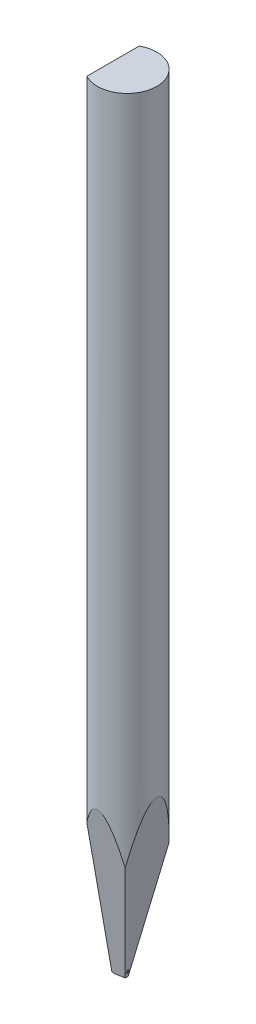
ISO-10303-21;
HEADER;
FILE_DESCRIPTION(('STEP AP214'),'2;1');
FILE_NAME('part.step','',(''),(''),'','','');
FILE_SCHEMA(('AUTOMOTIVE_DESIGN { 1 0 10303 214 1 1 1 1 }'));
ENDSEC;
DATA;
#1=APPLICATION_CONTEXT('core data for automotive mechanical design processes');
#2=APPLICATION_PROTOCOL_DEFINITION('international standard','automotive_design',2000,#1);
#3=PRODUCT_CONTEXT('',#1,'mechanical');
#4=PRODUCT('Part','Part','',(#3));
#5=PRODUCT_RELATED_PRODUCT_CATEGORY('part','',(#4));
#6=PRODUCT_DEFINITION_FORMATION('','',#4);
#7=PRODUCT_DEFINITION_CONTEXT('part definition',#1,'design');
#8=PRODUCT_DEFINITION('design','',#6,#7);
#9=PRODUCT_DEFINITION_SHAPE('','',#8);
#10=(LENGTH_UNIT() NAMED_UNIT(*) SI_UNIT(.MILLI.,.METRE.));
#11=(NAMED_UNIT(*) PLANE_ANGLE_UNIT() SI_UNIT($,.RADIAN.));
#12=(NAMED_UNIT(*) SI_UNIT($,.STERADIAN.) SOLID_ANGLE_UNIT());
#13=UNCERTAINTY_MEASURE_WITH_UNIT(LENGTH_MEASURE(1.E-05),#10,'distance_accuracy_value','');
#14=(GEOMETRIC_REPRESENTATION_CONTEXT(3) GLOBAL_UNCERTAINTY_ASSIGNED_CONTEXT((#13)) GLOBAL_UNIT_ASSIGNED_CONTEXT((#10,
#11,#12)) REPRESENTATION_CONTEXT('',''));
#15=CARTESIAN_POINT('',(0.,0.,0.));
#16=DIRECTION('',(0.,0.,1.));
#17=DIRECTION('',(1.,0.,0.));
#18=AXIS2_PLACEMENT_3D('',#15,#16,#17);
#19=CARTESIAN_POINT('',(-0.29972,0.,27.2760283406468));
#20=DIRECTION('',(-0.173648177666931,0.984807753012208,0.));
#21=DIRECTION('',(-0.984807753012208,-0.173648177666931,0.));
#22=AXIS2_PLACEMENT_3D('',#19,#20,#21);
#23=PLANE('',#22);
#24=DIRECTION('',(-0.984807753012208,-0.173648177666931,0.));
#25=VECTOR('',#24,1.);
#26=CARTESIAN_POINT('',(-0.29972,0.,0.0190499999999996));
#27=LINE('',#26,#25);
#28=CARTESIAN_POINT('',(-0.1397,0.0282158434529687,0.0190499999999998));
#29=VERTEX_POINT('',#28);
#30=CARTESIAN_POINT('',(-0.286429626386857,0.00234345145169317,0.01905));
#31=VERTEX_POINT('',#30);
#32=EDGE_CURVE('E172',#29,#31,#27,.T.);
#33=ORIENTED_EDGE('',*,*,#32,.F.);
#34=DIRECTION('',(0.,0.,1.));
#35=VECTOR('',#34,1.);
#36=CARTESIAN_POINT('',(-0.1397,0.0282158434529687,27.2760283406468));
#37=LINE('',#36,#35);
#38=CARTESIAN_POINT('',(-0.1397,0.0282158434529687,-0.0190499999999998));
#39=VERTEX_POINT('',#38);
#40=EDGE_CURVE('E11',#39,#29,#37,.T.);
#41=ORIENTED_EDGE('',*,*,#40,.F.);
#42=DIRECTION('',(-0.984807753012208,-0.173648177666931,0.));
#43=VECTOR('',#42,1.);
#44=CARTESIAN_POINT('',(-0.29972,0.,-0.0190499999999996));
#45=LINE('',#44,#43);
#46=CARTESIAN_POINT('',(-0.286429626386857,0.00234345145169317,-0.01905));
#47=VERTEX_POINT('',#46);
#48=EDGE_CURVE('E136',#39,#47,#45,.T.);
#49=ORIENTED_EDGE('',*,*,#48,.T.);
#50=CARTESIAN_POINT('',(-0.983960151536872,-0.12065,0.));
#51=DIRECTION('',(-0.173648177666931,0.984807753012208,0.));
#52=DIRECTION('',(-0.984807753012208,-0.173648177666931,0.));
#53=AXIS2_PLACEMENT_3D('',#50,#51,#52);
#54=ELLIPSE('',#53,0.716736574332053,0.12446);
#55=CARTESIAN_POINT('',(-0.299719999999998,0.,-0.0305196359577053));
#56=VERTEX_POINT('',#55);
#57=EDGE_CURVE('E214',#47,#56,#54,.T.);
#58=ORIENTED_EDGE('',*,*,#57,.T.);
#59=DIRECTION('',(0.984346441568213,0.173566836012845,-0.0306045161452665));
#60=VECTOR('',#59,1.);
#61=CARTESIAN_POINT('',(26.0298035813508,4.64260539659194,-0.849096592201888));
#62=LINE('',#61,#60);
#63=CARTESIAN_POINT('',(-0.0113543651851166,0.0508466417269886,-0.0394456348148849));
#64=VERTEX_POINT('',#63);
#65=EDGE_CURVE('E261',#56,#64,#62,.T.);
#66=ORIENTED_EDGE('',*,*,#65,.T.);
#67=DIRECTION('',(0.,0.,-1.));
#68=VECTOR('',#67,1.);
#69=CARTESIAN_POINT('',(-0.0113543651851151,0.0508466417269888,27.2760283406468));
#70=LINE('',#69,#68);
#71=CARTESIAN_POINT('',(-0.0113543651851166,0.0508466417269886,0.0394456348148849));
#72=VERTEX_POINT('',#71);
#73=EDGE_CURVE('E227',#72,#64,#70,.T.);
#74=ORIENTED_EDGE('',*,*,#73,.F.);
#75=DIRECTION('',(-0.984346441568213,-0.173566836012845,-0.0306045161452665));
#76=VECTOR('',#75,1.);
#77=CARTESIAN_POINT('',(26.0298035813508,4.64260539659194,0.849096592201888));
#78=LINE('',#77,#76);
#79=CARTESIAN_POINT('',(-0.299719999999996,0.,0.0305196359577053));
#80=VERTEX_POINT('',#79);
#81=EDGE_CURVE('E236',#72,#80,#78,.T.);
#82=ORIENTED_EDGE('',*,*,#81,.T.);
#83=EDGE_CURVE('E217',#80,#31,#54,.T.);
#84=ORIENTED_EDGE('',*,*,#83,.T.);
#85=EDGE_LOOP('',(#33,#41,#49,#58,#66,#74,#82,#84));
#86=FACE_BOUND('',#85,.T.);
#87=ADVANCED_FACE('F43',(#86),#23,.F.);
#88=CARTESIAN_POINT('',(26.8389469491216,-0.12065,0.));
#89=DIRECTION('',(-1.,0.,0.));
#90=DIRECTION('',(0.,0.,1.));
#91=AXIS2_PLACEMENT_3D('',#88,#89,#90);
#92=CYLINDRICAL_SURFACE('',#91,0.12446);
#93=DIRECTION('',(-1.,0.,0.));
#94=VECTOR('',#93,1.);
#95=CARTESIAN_POINT('',(26.8389469491216,0.00234345145169317,0.01905));
#96=LINE('',#95,#94);
#97=CARTESIAN_POINT('',(-0.301769962417407,0.00234345145169282,0.01905));
#98=VERTEX_POINT('',#97);
#99=EDGE_CURVE('E51',#31,#98,#96,.T.);
#100=ORIENTED_EDGE('',*,*,#99,.F.);
#101=ORIENTED_EDGE('',*,*,#83,.F.);
#102=CARTESIAN_POINT('',(-0.29972,0.,0.0305592719154106));
#103=DIRECTION('',(-1.,0.,0.));
#104=VECTOR('',#103,1.);
#105=LINE('',#102,#104);
#106=CARTESIAN_POINT('',(-0.347979999999999,0.,0.0305196359577053));
#107=VERTEX_POINT('',#106);
#108=EDGE_CURVE('E66',#80,#107,#105,.T.);
#109=ORIENTED_EDGE('',*,*,#108,.T.);
#110=CARTESIAN_POINT('',(-0.34798,0.,-0.0305592719154105));
#111=CARTESIAN_POINT('',(-0.348430814510365,-4.0790157401786E-07,-0.030560581386463));
#112=CARTESIAN_POINT('',(-0.348879913015498,1.08939864350477E-05,-0.0305162789202461));
#113=CARTESIAN_POINT('',(-0.349756979795945,5.32586660468888E-05,-0.0303484247483048));
#114=CARTESIAN_POINT('',(-0.350185131865885,8.40923596505527E-05,-0.0302257916828257));
#115=CARTESIAN_POINT('',(-0.351011762424045,0.000161841460247365,-0.0299134495677672));
#116=CARTESIAN_POINT('',(-0.351410362022562,0.000208686245204474,-0.0297240349657186));
#117=CARTESIAN_POINT('',(-0.352176540220128,0.000314247686217708,-0.0292915141713706));
#118=CARTESIAN_POINT('',(-0.352544019029949,0.000373000623512143,-0.0290482436791118));
#119=CARTESIAN_POINT('',(-0.353492609976714,0.000542464303570054,-0.0283352771344417));
#120=CARTESIAN_POINT('',(-0.354042823136011,0.000660718500816304,-0.0278264292093499));
#121=CARTESIAN_POINT('',(-0.355058485849617,0.000906480045085761,-0.0267326241717132));
#122=CARTESIAN_POINT('',(-0.355523692710971,0.00103401247561593,-0.0261474570746311));
#123=CARTESIAN_POINT('',(-0.356737267127974,0.00139509322037842,-0.024424665265501));
#124=CARTESIAN_POINT('',(-0.357402825120589,0.00162934905892421,-0.0232293596959535));
#125=CARTESIAN_POINT('',(-0.358560754617679,0.00207372872141576,-0.0207553925747807));
#126=CARTESIAN_POINT('',(-0.359052698197646,0.00228379206987497,-0.0194765341415885));
#127=CARTESIAN_POINT('',(-0.36030774701552,0.00284958434009851,-0.0156411550181883));
#128=CARTESIAN_POINT('',(-0.360888602450784,0.00315568845104849,-0.0130178775361172));
#129=CARTESIAN_POINT('',(-0.361706163735848,0.00360035199279706,-0.00770331230592785));
#130=CARTESIAN_POINT('',(-0.361941722221542,0.00373835258818556,-0.00501182791337141));
#131=CARTESIAN_POINT('',(-0.362122159422928,0.00384312710698266,0.000626307070904409));
#132=CARTESIAN_POINT('',(-0.362039043463169,0.00379341669557573,0.00357417277699146));
#133=CARTESIAN_POINT('',(-0.36150170314798,0.00348744188955353,0.00941520395438301));
#134=CARTESIAN_POINT('',(-0.361049465589899,0.0032322834184667,0.0123085776336631));
#135=CARTESIAN_POINT('',(-0.360101881253082,0.00276522394071858,0.0161243719322801));
#136=CARTESIAN_POINT('',(-0.359823561043634,0.00263206670724784,0.0171113029227183));
#137=CARTESIAN_POINT('',(-0.359191091592352,0.00234550293161942,0.0190622381461741));
#138=CARTESIAN_POINT('',(-0.358836664817193,0.00219202308727775,0.0200261437209395));
#139=CARTESIAN_POINT('',(-0.35792019094462,0.00182196264863964,0.0221910750494741));
#140=CARTESIAN_POINT('',(-0.35732773854375,0.00160009037378041,0.0233785738678838));
#141=CARTESIAN_POINT('',(-0.355941185679961,0.00114822728257018,0.0256274014231926));
#142=CARTESIAN_POINT('',(-0.35514861217987,0.000918308819136108,0.0266895999907303));
#143=CARTESIAN_POINT('',(-0.353869594547934,0.000625501592054897,0.027976474269296));
#144=CARTESIAN_POINT('',(-0.353498623594593,0.000547541257563668,0.0283116735867265));
#145=CARTESIAN_POINT('',(-0.352713845163361,0.000401035258663639,0.0289316105181223));
#146=CARTESIAN_POINT('',(-0.352300015965373,0.000332494409296592,0.0292163223453788));
#147=CARTESIAN_POINT('',(-0.35142414885153,0.000209524327572587,0.0297209697927657));
#148=CARTESIAN_POINT('',(-0.350961529273433,0.000155300800887052,0.0299399667559707));
#149=CARTESIAN_POINT('',(-0.350001496573154,6.91140443385488E-05,0.030285638001186));
#150=CARTESIAN_POINT('',(-0.349504228801302,3.70633361955864E-05,0.0304126751846489));
#151=CARTESIAN_POINT('',(-0.348830789757912,1.24370193427594E-05,0.0305101337557273));
#152=CARTESIAN_POINT('',(-0.348661251457123,7.78649892713723E-06,0.0305285162109277));
#153=CARTESIAN_POINT('',(-0.348321176485651,1.56788977353475E-06,0.0305530840375707));
#154=CARTESIAN_POINT('',(-0.348150639475355,9.18970805127776E-10,0.0305592649853819));
#155=CARTESIAN_POINT('',(-0.347980000000024,0.,0.0305592719155779));
#156=B_SPLINE_CURVE_WITH_KNOTS('',3,(#110,#111,#112,#113,#114,#115,#116,#117,#118,#119,#120,
#121,#122,#123,#124,#125,#126,#127,#128,#129,#130,#131,#132,#133,#134,#135,#136,#137,#138,#139,
#140,#141,#142,#143,#144,#145,#146,#147,#148,#149,#150,#151,#152,#153,#154,#155),.UNSPECIFIED.,
.F.,.F.,(4,2,2,2,2,2,2,2,2,2,2,2,2,2,2,2,2,2,2,2,2,2,4),(0.,0.00134741004079565,
0.00267930111383719,0.00400539168870872,0.00533558497102969,0.00759858100656418,
0.00986794025135302,0.0140085166125864,0.0181592285296514,0.0262271883927134,0.0343218964425103,
0.0431433167180924,0.0519175663828487,0.0550173321670425,0.0581285996977776,0.0621538633051677,
0.0661492954960546,0.0676639727026794,0.0691794213229861,0.0707155853403851,0.0722456536356855,
0.0727570681004673,0.0732686679434896),.UNSPECIFIED.);
#157=CARTESIAN_POINT('',(-0.347980000000002,0.,-0.030519635957705));
#158=VERTEX_POINT('',#157);
#159=EDGE_CURVE('E212',#158,#107,#156,.T.);
#160=ORIENTED_EDGE('',*,*,#159,.F.);
#161=CARTESIAN_POINT('',(-0.299719999999993,0.,-0.0304800000000001));
#162=DIRECTION('',(-1.,0.,0.));
#163=VECTOR('',#162,1.);
#164=LINE('',#161,#163);
#165=EDGE_CURVE('E241',#56,#158,#164,.T.);
#166=ORIENTED_EDGE('',*,*,#165,.F.);
#167=ORIENTED_EDGE('',*,*,#57,.F.);
#168=DIRECTION('',(-1.,0.,0.));
#169=VECTOR('',#168,1.);
#170=CARTESIAN_POINT('',(26.8389469491216,0.00234345145169317,-0.01905));
#171=LINE('',#170,#169);
#172=CARTESIAN_POINT('',(-0.301769962417407,0.00234345145169364,-0.01905));
#173=VERTEX_POINT('',#172);
#174=EDGE_CURVE('E218',#47,#173,#171,.T.);
#175=ORIENTED_EDGE('',*,*,#174,.T.);
#176=CARTESIAN_POINT('',(-0.301769962417407,0.00234345145169314,-0.01905));
#177=CARTESIAN_POINT('',(-0.303083212357795,0.00234273884135903,-0.0190505532683335));
#178=CARTESIAN_POINT('',(-0.304398530056794,0.00235919648592935,-0.0189481276282325));
#179=CARTESIAN_POINT('',(-0.307000954094572,0.00242318594032791,-0.0185302442706134));
#180=CARTESIAN_POINT('',(-0.308287873692993,0.00247088218091991,-0.0182136589885027));
#181=CARTESIAN_POINT('',(-0.310790852582439,0.00259423811870583,-0.0173587153989119));
#182=CARTESIAN_POINT('',(-0.312006641691863,0.00266999731654825,-0.0168195671794881));
#183=CARTESIAN_POINT('',(-0.314311894657055,0.00283986679158173,-0.015523243690556));
#184=CARTESIAN_POINT('',(-0.315401659849181,0.00293393178806268,-0.0147666042420507));
#185=CARTESIAN_POINT('',(-0.31730332104955,0.00311685645192294,-0.0131397171256992));
#186=CARTESIAN_POINT('',(-0.318132319467869,0.00320524260215012,-0.0122894206437063));
#187=CARTESIAN_POINT('',(-0.3196165652278,0.00337418177810725,-0.0104472759959153));
#188=CARTESIAN_POINT('',(-0.320271844381019,0.00345473623626944,-0.00945545379765719));
#189=CARTESIAN_POINT('',(-0.3213234426909,0.00358935319513246,-0.00746762605607109));
#190=CARTESIAN_POINT('',(-0.32173909228563,0.00364525831027112,-0.00648193686690554));
#191=CARTESIAN_POINT('',(-0.322389726393463,0.00373449435681656,-0.0044518189481206));
#192=CARTESIAN_POINT('',(-0.322624798676981,0.00376783625423748,-0.00340741902037943));
#193=CARTESIAN_POINT('',(-0.322897837996913,0.00380671319708877,-0.00134948273672548));
#194=CARTESIAN_POINT('',(-0.322945634936013,0.00381363450040313,-0.000337264641997512));
#195=CARTESIAN_POINT('',(-0.322869697716228,0.00380274111245844,0.00168052629893266));
#196=CARTESIAN_POINT('',(-0.322745983850237,0.00378492934757725,0.00268609991715538));
#197=CARTESIAN_POINT('',(-0.322334355344498,0.00372702254235129,0.0046473278957709));
#198=CARTESIAN_POINT('',(-0.322048793640665,0.00368724701865936,0.00560348787902325));
#199=CARTESIAN_POINT('',(-0.321324937242233,0.00358998817113897,0.00745501684823445));
#200=CARTESIAN_POINT('',(-0.320886639683836,0.00353250451528526,0.00835038469396416));
#201=CARTESIAN_POINT('',(-0.319862680839835,0.00340476764403495,0.0100730618825254));
#202=CARTESIAN_POINT('',(-0.319274533821476,0.00333430521919907,0.0108988749361181));
#203=CARTESIAN_POINT('',(-0.317974173980919,0.00318863460274331,0.0124454369952645));
#204=CARTESIAN_POINT('',(-0.317261944798882,0.00311342578616174,0.0131661721235828));
#205=CARTESIAN_POINT('',(-0.31569583062112,0.00296171888527247,0.0145232749481605));
#206=CARTESIAN_POINT('',(-0.314836555870207,0.00288535232362802,0.0151534243532859));
#207=CARTESIAN_POINT('',(-0.313030647680624,0.00274271134593144,0.0162742350252514));
#208=CARTESIAN_POINT('',(-0.312083969657596,0.00267644212671652,0.0167648245761543));
#209=CARTESIAN_POINT('',(-0.31004264333725,0.00255444746912226,0.0176399463518506));
#210=CARTESIAN_POINT('',(-0.308942302803632,0.00250016076595805,0.0180113663892418));
#211=CARTESIAN_POINT('',(-0.306698785837096,0.00241476087320615,0.0185861575843008));
#212=CARTESIAN_POINT('',(-0.305555627526932,0.00238363799331208,0.0187895990176943));
#213=CARTESIAN_POINT('',(-0.30352895790095,0.00235048998193052,0.0190043678177182));
#214=CARTESIAN_POINT('',(-0.302649080375743,0.00234326902739348,0.0190501179681685));
#215=CARTESIAN_POINT('',(-0.301769962417412,0.00234345145168755,0.0190500000000401));
#216=B_SPLINE_CURVE_WITH_KNOTS('',3,(#176,#177,#178,#179,#180,#181,#182,#183,#184,#185,#186,
#187,#188,#189,#190,#191,#192,#193,#194,#195,#196,#197,#198,#199,#200,#201,#202,#203,#204,#205,
#206,#207,#208,#209,#210,#211,#212,#213,#214,#215),.UNSPECIFIED.,.F.,.F.,(4,2,2,2,2,2,2,2,2,2,2,
2,2,2,2,2,2,2,2,4),(0.,0.0039388640861778,0.00789862964445358,0.0118725715602336,
0.0158368057995756,0.0193894604666261,0.0229414641187126,0.0261386218593387,0.0293342246220546,
0.0323596502009959,0.0353847178468262,0.0383668955619843,0.0413491291960031,0.0443844811882459,
0.0474202336852696,0.0506115954385173,0.0538045941937902,0.0572782451267952,0.0607504420817328,
0.063388074501748),.UNSPECIFIED.);
#217=EDGE_CURVE('E308',#173,#98,#216,.T.);
#218=ORIENTED_EDGE('',*,*,#217,.T.);
#219=EDGE_LOOP('',(#100,#101,#109,#160,#166,#167,#175,#218));
#220=FACE_BOUND('',#219,.T.);
#221=ADVANCED_FACE('F182',(#220),#92,.F.);
#222=CARTESIAN_POINT('',(26.8738719491216,0.,0.03048));
#223=DIRECTION('',(0.,-0.173648177666931,0.984807753012208));
#224=DIRECTION('',(0.,-0.984807753012208,-0.173648177666931));
#225=AXIS2_PLACEMENT_3D('',#222,#223,#224);
#226=PLANE('',#225);
#227=CARTESIAN_POINT('',(-0.34798,0.02794,0.0354065758409947));
#228=DIRECTION('',(0.,-0.173648177666931,0.984807753012208));
#229=DIRECTION('',(0.,-0.984807753012208,-0.173648177666931));
#230=AXIS2_PLACEMENT_3D('',#227,#228,#229);
#231=ELLIPSE('',#230,0.0283710195360877,0.02794);
#232=CARTESIAN_POINT('',(-0.37592,0.02794,0.0354065758409947));
#233=VERTEX_POINT('',#232);
#234=EDGE_CURVE('E226',#107,#233,#231,.F.);
#235=ORIENTED_EDGE('',*,*,#234,.F.);
#236=ORIENTED_EDGE('',*,*,#108,.F.);
#237=ORIENTED_EDGE('',*,*,#81,.F.);
#238=DIRECTION('',(-0.171087869746036,-0.970287525247814,-0.171087869746036));
#239=VECTOR('',#238,1.);
#240=CARTESIAN_POINT('',(0.766901483986011,4.46455489014234,0.817701483986016));
#241=LINE('',#240,#239);
#242=CARTESIAN_POINT('',(0.534392028524877,3.1459282424964,0.58519202852488));
#243=VERTEX_POINT('',#242);
#244=EDGE_CURVE('E233',#243,#72,#241,.T.);
#245=ORIENTED_EDGE('',*,*,#244,.F.);
#246=CARTESIAN_POINT('',(0.,-0.172860669861948,0.));
#247=DIRECTION('',(0.,-0.173648177666931,0.984807753012208));
#248=DIRECTION('',(0.,-0.984807753012208,-0.173648177666931));
#249=AXIS2_PLACEMENT_3D('',#246,#247,#248);
#250=ELLIPSE('',#249,4.56371043248163,0.792479999999998);
#251=CARTESIAN_POINT('',(-0.37592,3.78368137728878,0.69764511322018));
#252=VERTEX_POINT('',#251);
#253=EDGE_CURVE('E237',#243,#252,#250,.T.);
#254=ORIENTED_EDGE('',*,*,#253,.T.);
#255=DIRECTION('',(0.,0.984807753012208,0.173648177666931));
#256=VECTOR('',#255,1.);
#257=CARTESIAN_POINT('',(-0.37592,20.2128607163583,3.59455270159622));
#258=LINE('',#257,#256);
#259=EDGE_CURVE('E253',#233,#252,#258,.T.);
#260=ORIENTED_EDGE('',*,*,#259,.F.);
#261=EDGE_LOOP('',(#235,#236,#237,#245,#254,#260));
#262=FACE_BOUND('',#261,.T.);
#263=ADVANCED_FACE('F192',(#262),#226,.T.);
#264=CARTESIAN_POINT('',(26.8738719491216,0.,-0.03048));
#265=DIRECTION('',(0.,-0.173648177666931,-0.984807753012208));
#266=DIRECTION('',(0.,0.984807753012208,-0.173648177666931));
#267=AXIS2_PLACEMENT_3D('',#264,#265,#266);
#268=PLANE('',#267);
#269=CARTESIAN_POINT('',(-0.34798,0.02794,-0.0354065758409947));
#270=DIRECTION('',(0.,-0.173648177666931,-0.984807753012208));
#271=DIRECTION('',(0.,0.984807753012208,-0.173648177666931));
#272=AXIS2_PLACEMENT_3D('',#269,#270,#271);
#273=ELLIPSE('',#272,0.0283710195360877,0.02794);
#274=CARTESIAN_POINT('',(-0.37592,0.02794,-0.0354065758409947));
#275=VERTEX_POINT('',#274);
#276=EDGE_CURVE('E300',#275,#158,#273,.F.);
#277=ORIENTED_EDGE('',*,*,#276,.F.);
#278=DIRECTION('',(0.,-0.984807753012208,0.173648177666931));
#279=VECTOR('',#278,1.);
#280=CARTESIAN_POINT('',(-0.37592,20.5707779559457,-3.65766316779618));
#281=LINE('',#280,#279);
#282=CARTESIAN_POINT('',(-0.37592,3.78368137728877,-0.69764511322018));
#283=VERTEX_POINT('',#282);
#284=EDGE_CURVE('E255',#283,#275,#281,.T.);
#285=ORIENTED_EDGE('',*,*,#284,.F.);
#286=CARTESIAN_POINT('',(0.,-0.172860669861948,0.));
#287=DIRECTION('',(0.,-0.173648177666931,-0.984807753012208));
#288=DIRECTION('',(0.,-0.984807753012208,0.173648177666931));
#289=AXIS2_PLACEMENT_3D('',#286,#287,#288);
#290=ELLIPSE('',#289,4.56371043248163,0.792479999999998);
#291=CARTESIAN_POINT('',(0.534392028524877,3.1459282424964,-0.58519202852488));
#292=VERTEX_POINT('',#291);
#293=EDGE_CURVE('E240',#283,#292,#290,.T.);
#294=ORIENTED_EDGE('',*,*,#293,.T.);
#295=DIRECTION('',(0.171087869746036,0.970287525247814,-0.171087869746036));
#296=VECTOR('',#295,1.);
#297=CARTESIAN_POINT('',(0.766901483986011,4.46455489014234,-0.817701483986016));
#298=LINE('',#297,#296);
#299=EDGE_CURVE('E258',#64,#292,#298,.T.);
#300=ORIENTED_EDGE('',*,*,#299,.F.);
#301=ORIENTED_EDGE('',*,*,#65,.F.);
#302=ORIENTED_EDGE('',*,*,#165,.T.);
#303=EDGE_LOOP('',(#277,#285,#294,#300,#301,#302));
#304=FACE_BOUND('',#303,.T.);
#305=ADVANCED_FACE('F280',(#304),#268,.T.);
#306=CARTESIAN_POINT('',(0.,21.0312,0.));
#307=DIRECTION('',(0.,-1.,0.));
#308=DIRECTION('',(0.,0.,-1.));
#309=AXIS2_PLACEMENT_3D('',#306,#307,#308);
#310=CYLINDRICAL_SURFACE('',#309,0.792479999999998);
#311=ORIENTED_EDGE('',*,*,#253,.F.);
#312=CARTESIAN_POINT('',(0.,0.115240446574631,0.));
#313=DIRECTION('',(-0.984807753012208,0.173648177666931,0.));
#314=DIRECTION('',(-0.173648177666931,-0.984807753012208,0.));
#315=AXIS2_PLACEMENT_3D('',#312,#313,#314);
#316=ELLIPSE('',#315,4.56371043248165,0.792479999999998);
#317=EDGE_CURVE('E230',#243,#292,#316,.T.);
#318=ORIENTED_EDGE('',*,*,#317,.T.);
#319=ORIENTED_EDGE('',*,*,#293,.F.);
#320=DIRECTION('',(0.,-1.,0.));
#321=VECTOR('',#320,1.);
#322=CARTESIAN_POINT('',(-0.37592,21.0312,-0.69764511322018));
#323=LINE('',#322,#321);
#324=CARTESIAN_POINT('',(-0.37592,21.0312,-0.69764511322018));
#325=VERTEX_POINT('',#324);
#326=EDGE_CURVE('E247',#325,#283,#323,.T.);
#327=ORIENTED_EDGE('',*,*,#326,.F.);
#328=CARTESIAN_POINT('',(0.,21.0312,0.));
#329=DIRECTION('',(0.,1.,0.));
#330=DIRECTION('',(0.,0.,1.));
#331=AXIS2_PLACEMENT_3D('',#328,#329,#330);
#332=CIRCLE('',#331,0.792479999999998);
#333=CARTESIAN_POINT('',(-0.37592,21.0312,0.69764511322018));
#334=VERTEX_POINT('',#333);
#335=EDGE_CURVE('E250',#334,#325,#332,.T.);
#336=ORIENTED_EDGE('',*,*,#335,.F.);
#337=DIRECTION('',(0.,-1.,0.));
#338=VECTOR('',#337,1.);
#339=CARTESIAN_POINT('',(-0.37592,21.0312,0.69764511322018));
#340=LINE('',#339,#338);
#341=EDGE_CURVE('E245',#252,#334,#340,.F.);
#342=ORIENTED_EDGE('',*,*,#341,.F.);
#343=EDGE_LOOP('',(#311,#318,#319,#327,#336,#342));
#344=FACE_BOUND('',#343,.T.);
#345=ADVANCED_FACE('F45',(#344),#310,.T.);
#346=CARTESIAN_POINT('',(-0.37592,21.0312,-1.04648));
#347=DIRECTION('',(-1.,0.,0.));
#348=DIRECTION('',(0.,0.,1.));
#349=AXIS2_PLACEMENT_3D('',#346,#347,#348);
#350=PLANE('',#349);
#351=DIRECTION('',(0.,0.,-1.));
#352=VECTOR('',#351,1.);
#353=CARTESIAN_POINT('',(-0.37592,0.02794,26.4420719491216));
#354=LINE('',#353,#352);
#355=EDGE_CURVE('E222',#233,#275,#354,.T.);
#356=ORIENTED_EDGE('',*,*,#355,.F.);
#357=ORIENTED_EDGE('',*,*,#259,.T.);
#358=ORIENTED_EDGE('',*,*,#341,.T.);
#359=DIRECTION('',(0.,0.,-1.));
#360=VECTOR('',#359,1.);
#361=CARTESIAN_POINT('',(-0.37592,21.0312,-1.04648));
#362=LINE('',#361,#360);
#363=EDGE_CURVE('E243',#334,#325,#362,.T.);
#364=ORIENTED_EDGE('',*,*,#363,.T.);
#365=ORIENTED_EDGE('',*,*,#326,.T.);
#366=ORIENTED_EDGE('',*,*,#284,.T.);
#367=EDGE_LOOP('',(#356,#357,#358,#364,#365,#366));
#368=FACE_BOUND('',#367,.T.);
#369=ADVANCED_FACE('F285',(#368),#350,.T.);
#370=CARTESIAN_POINT('',(0.,21.0312,0.));
#371=DIRECTION('',(0.,1.,0.));
#372=DIRECTION('',(0.,0.,1.));
#373=AXIS2_PLACEMENT_3D('',#370,#371,#372);
#374=PLANE('',#373);
#375=ORIENTED_EDGE('',*,*,#335,.T.);
#376=ORIENTED_EDGE('',*,*,#363,.F.);
#377=EDGE_LOOP('',(#375,#376));
#378=FACE_BOUND('',#377,.T.);
#379=ADVANCED_FACE('F325',(#378),#374,.T.);
#380=CARTESIAN_POINT('',(-0.0113543651851151,0.0508466417269888,27.2760283406468));
#381=DIRECTION('',(-0.984807753012208,0.173648177666931,0.));
#382=DIRECTION('',(-0.173648177666931,-0.984807753012208,0.));
#383=AXIS2_PLACEMENT_3D('',#380,#381,#382);
#384=PLANE('',#383);
#385=CARTESIAN_POINT('',(0.0138139834213155,0.193583439608439,0.));
#386=DIRECTION('',(-0.984807753012208,0.173648177666931,0.));
#387=DIRECTION('',(0.173648177666931,0.984807753012208,0.));
#388=AXIS2_PLACEMENT_3D('',#385,#386,#387);
#389=ELLIPSE('',#388,0.0439502823592256,0.0315688581959235);
#390=CARTESIAN_POINT('',(0.0214458698609421,0.23686601842288,0.));
#391=VERTEX_POINT('',#390);
#392=EDGE_CURVE('E174',#391,#391,#389,.F.);
#393=ORIENTED_EDGE('',*,*,#392,.F.);
#394=EDGE_LOOP('',(#393));
#395=FACE_BOUND('',#394,.T.);
#396=ORIENTED_EDGE('',*,*,#317,.F.);
#397=ORIENTED_EDGE('',*,*,#244,.T.);
#398=ORIENTED_EDGE('',*,*,#73,.T.);
#399=ORIENTED_EDGE('',*,*,#299,.T.);
#400=EDGE_LOOP('',(#396,#397,#398,#399));
#401=FACE_BOUND('',#400,.T.);
#402=ADVANCED_FACE('F322',(#395,#401),#384,.F.);
#403=CARTESIAN_POINT('',(-0.34798,0.02794,26.4420719491216));
#404=DIRECTION('',(0.,0.,-1.));
#405=DIRECTION('',(-1.,0.,0.));
#406=AXIS2_PLACEMENT_3D('',#403,#404,#405);
#407=CYLINDRICAL_SURFACE('',#406,0.02794);
#408=ORIENTED_EDGE('',*,*,#276,.T.);
#409=ORIENTED_EDGE('',*,*,#159,.T.);
#410=ORIENTED_EDGE('',*,*,#234,.T.);
#411=ORIENTED_EDGE('',*,*,#355,.T.);
#412=EDGE_LOOP('',(#408,#409,#410,#411));
#413=FACE_BOUND('',#412,.T.);
#414=ADVANCED_FACE('F197',(#413),#407,.T.);
#415=CARTESIAN_POINT('',(-0.1397,0.09144,0.01905));
#416=DIRECTION('',(-1.,0.,0.));
#417=DIRECTION('',(0.,-1.,0.));
#418=AXIS2_PLACEMENT_3D('',#415,#416,#417);
#419=PLANE('',#418);
#420=ORIENTED_EDGE('',*,*,#40,.T.);
#421=DIRECTION('',(0.,1.,0.));
#422=VECTOR('',#421,1.);
#423=CARTESIAN_POINT('',(-0.1397,0.09144,0.01905));
#424=LINE('',#423,#422);
#425=CARTESIAN_POINT('',(-0.1397,0.09144,0.01905));
#426=VERTEX_POINT('',#425);
#427=EDGE_CURVE('E146',#29,#426,#424,.T.);
#428=ORIENTED_EDGE('',*,*,#427,.T.);
#429=CARTESIAN_POINT('',(-0.1397,0.0914400000000001,0.));
#430=DIRECTION('',(-1.,0.,0.));
#431=DIRECTION('',(0.,1.,0.));
#432=AXIS2_PLACEMENT_3D('',#429,#430,#431);
#433=ELLIPSE('',#432,0.0219970452561247,0.01905);
#434=CARTESIAN_POINT('',(-0.1397,0.09144,-0.01905));
#435=VERTEX_POINT('',#434);
#436=EDGE_CURVE('E142',#426,#435,#433,.F.);
#437=ORIENTED_EDGE('',*,*,#436,.T.);
#438=DIRECTION('',(0.,1.,0.));
#439=VECTOR('',#438,1.);
#440=CARTESIAN_POINT('',(-0.1397,0.09144,-0.01905));
#441=LINE('',#440,#439);
#442=EDGE_CURVE('E130',#39,#435,#441,.T.);
#443=ORIENTED_EDGE('',*,*,#442,.F.);
#444=EDGE_LOOP('',(#420,#428,#437,#443));
#445=FACE_BOUND('',#444,.T.);
#446=ADVANCED_FACE('F144',(#445),#419,.T.);
#447=CARTESIAN_POINT('',(-0.0108977128619794,0.165804035151375,0.));
#448=DIRECTION('',(0.866025403784441,0.499999999999995,0.));
#449=DIRECTION('',(-0.499999999999995,0.866025403784441,0.));
#450=AXIS2_PLACEMENT_3D('',#447,#448,#449);
#451=CONICAL_SURFACE('',#450,0.01905,0.392699081698725);
#452=CARTESIAN_POINT('',(-0.0108977128619794,0.165804035151375,0.));
#453=DIRECTION('',(0.866025403784441,0.499999999999995,0.));
#454=DIRECTION('',(-0.499999999999995,0.866025403784441,0.));
#455=AXIS2_PLACEMENT_3D('',#452,#453,#454);
#456=CIRCLE('',#455,0.01905);
#457=CARTESIAN_POINT('',(-0.0204227128619793,0.182301819093468,0.));
#458=VERTEX_POINT('',#457);
#459=EDGE_CURVE('E150',#458,#458,#456,.T.);
#460=ORIENTED_EDGE('',*,*,#459,.F.);
#461=EDGE_LOOP('',(#460));
#462=FACE_BOUND('',#461,.T.);
#463=ORIENTED_EDGE('',*,*,#392,.T.);
#464=EDGE_LOOP('',(#463));
#465=FACE_BOUND('',#464,.T.);
#466=ADVANCED_FACE('F320',(#462,#465),#451,.F.);
#467=CARTESIAN_POINT('',(-0.250330046129175,0.09144,0.));
#468=DIRECTION('',(-0.500000000000004,-0.866025403784436,0.));
#469=DIRECTION('',(0.866025403784436,-0.500000000000004,0.));
#470=AXIS2_PLACEMENT_3D('',#467,#468,#469);
#471=CYLINDRICAL_SURFACE('',#470,0.01905);
#472=DIRECTION('',(0.500000000000004,0.866025403784436,0.));
#473=VECTOR('',#472,1.);
#474=CARTESIAN_POINT('',(-0.250330046129175,0.09144,-0.01905));
#475=LINE('',#474,#473);
#476=CARTESIAN_POINT('',(-0.250330046129175,0.09144,-0.01905));
#477=VERTEX_POINT('',#476);
#478=EDGE_CURVE('E58',#173,#477,#475,.T.);
#479=ORIENTED_EDGE('',*,*,#478,.T.);
#480=CARTESIAN_POINT('',(-0.250330046129175,0.09144,0.));
#481=DIRECTION('',(0.,-1.,0.));
#482=DIRECTION('',(-1.,0.,0.));
#483=AXIS2_PLACEMENT_3D('',#480,#481,#482);
#484=ELLIPSE('',#483,0.0219970452561248,0.01905);
#485=CARTESIAN_POINT('',(-0.250330046129175,0.09144,0.01905));
#486=VERTEX_POINT('',#485);
#487=EDGE_CURVE('E159',#477,#486,#484,.F.);
#488=ORIENTED_EDGE('',*,*,#487,.T.);
#489=DIRECTION('',(-0.500000000000004,-0.866025403784436,0.));
#490=VECTOR('',#489,1.);
#491=CARTESIAN_POINT('',(-0.227342216057905,0.131256089639199,0.01905));
#492=LINE('',#491,#490);
#493=EDGE_CURVE('E166',#486,#98,#492,.T.);
#494=ORIENTED_EDGE('',*,*,#493,.T.);
#495=ORIENTED_EDGE('',*,*,#217,.F.);
#496=EDGE_LOOP('',(#479,#488,#494,#495));
#497=FACE_BOUND('',#496,.T.);
#498=ADVANCED_FACE('F194',(#497),#471,.F.);
#499=CARTESIAN_POINT('',(0.,0.,0.01905));
#500=DIRECTION('',(0.,0.,-1.));
#501=DIRECTION('',(-1.,0.,0.));
#502=AXIS2_PLACEMENT_3D('',#499,#500,#501);
#503=PLANE('',#502);
#504=ORIENTED_EDGE('',*,*,#32,.T.);
#505=ORIENTED_EDGE('',*,*,#99,.T.);
#506=ORIENTED_EDGE('',*,*,#493,.F.);
#507=DIRECTION('',(-1.,0.,0.));
#508=VECTOR('',#507,1.);
#509=CARTESIAN_POINT('',(-0.2723270913853,0.09144,0.01905));
#510=LINE('',#509,#508);
#511=EDGE_CURVE('E139',#426,#486,#510,.T.);
#512=ORIENTED_EDGE('',*,*,#511,.F.);
#513=ORIENTED_EDGE('',*,*,#427,.F.);
#514=EDGE_LOOP('',(#504,#505,#506,#512,#513));
#515=FACE_BOUND('',#514,.T.);
#516=ADVANCED_FACE('F341',(#515),#503,.T.);
#517=CARTESIAN_POINT('',(0.,0.,-0.01905));
#518=DIRECTION('',(0.,0.,-1.));
#519=DIRECTION('',(-1.,0.,0.));
#520=AXIS2_PLACEMENT_3D('',#517,#518,#519);
#521=PLANE('',#520);
#522=ORIENTED_EDGE('',*,*,#442,.T.);
#523=DIRECTION('',(-1.,0.,0.));
#524=VECTOR('',#523,1.);
#525=CARTESIAN_POINT('',(-0.2723270913853,0.09144,-0.01905));
#526=LINE('',#525,#524);
#527=EDGE_CURVE('E134',#435,#477,#526,.T.);
#528=ORIENTED_EDGE('',*,*,#527,.T.);
#529=ORIENTED_EDGE('',*,*,#478,.F.);
#530=ORIENTED_EDGE('',*,*,#174,.F.);
#531=ORIENTED_EDGE('',*,*,#48,.F.);
#532=EDGE_LOOP('',(#522,#528,#529,#530,#531));
#533=FACE_BOUND('',#532,.T.);
#534=ADVANCED_FACE('F132',(#533),#521,.F.);
#535=CARTESIAN_POINT('',(-0.2723270913853,0.09144,0.01905));
#536=DIRECTION('',(0.,-1.,0.));
#537=DIRECTION('',(0.,0.,-1.));
#538=AXIS2_PLACEMENT_3D('',#535,#536,#537);
#539=PLANE('',#538);
#540=ORIENTED_EDGE('',*,*,#527,.F.);
#541=CARTESIAN_POINT('',(-0.1397,0.09144,0.));
#542=DIRECTION('',(0.,-1.,0.));
#543=DIRECTION('',(1.,0.,0.));
#544=AXIS2_PLACEMENT_3D('',#541,#542,#543);
#545=ELLIPSE('',#544,0.0381000000000004,0.01905);
#546=EDGE_CURVE('E151',#435,#426,#545,.F.);
#547=ORIENTED_EDGE('',*,*,#546,.T.);
#548=ORIENTED_EDGE('',*,*,#511,.T.);
#549=ORIENTED_EDGE('',*,*,#487,.F.);
#550=EDGE_LOOP('',(#540,#547,#548,#549));
#551=FACE_BOUND('',#550,.T.);
#552=ADVANCED_FACE('F158',(#551),#539,.T.);
#553=CARTESIAN_POINT('',(-0.320091732268594,-0.0127092151848543,0.));
#554=DIRECTION('',(0.866025403784441,0.499999999999995,0.));
#555=DIRECTION('',(-0.499999999999995,0.866025403784441,0.));
#556=AXIS2_PLACEMENT_3D('',#553,#554,#555);
#557=CYLINDRICAL_SURFACE('',#556,0.01905);
#558=ORIENTED_EDGE('',*,*,#459,.T.);
#559=EDGE_LOOP('',(#558));
#560=FACE_BOUND('',#559,.T.);
#561=ORIENTED_EDGE('',*,*,#436,.F.);
#562=ORIENTED_EDGE('',*,*,#546,.F.);
#563=EDGE_LOOP('',(#561,#562));
#564=FACE_BOUND('',#563,.T.);
#565=ADVANCED_FACE('F153',(#560,#564),#557,.F.);
#566=CLOSED_SHELL('',(#87,#221,#263,#305,#345,#369,#379,#402,#414,#446,#466,#498,#516,#534,#552,#565));
#567=MANIFOLD_SOLID_BREP('B2',#566);
#568=ADVANCED_BREP_SHAPE_REPRESENTATION('',(#18,#567),#14);
#569=SHAPE_DEFINITION_REPRESENTATION(#9,#568);
ENDSEC;
END-ISO-10303-21;
